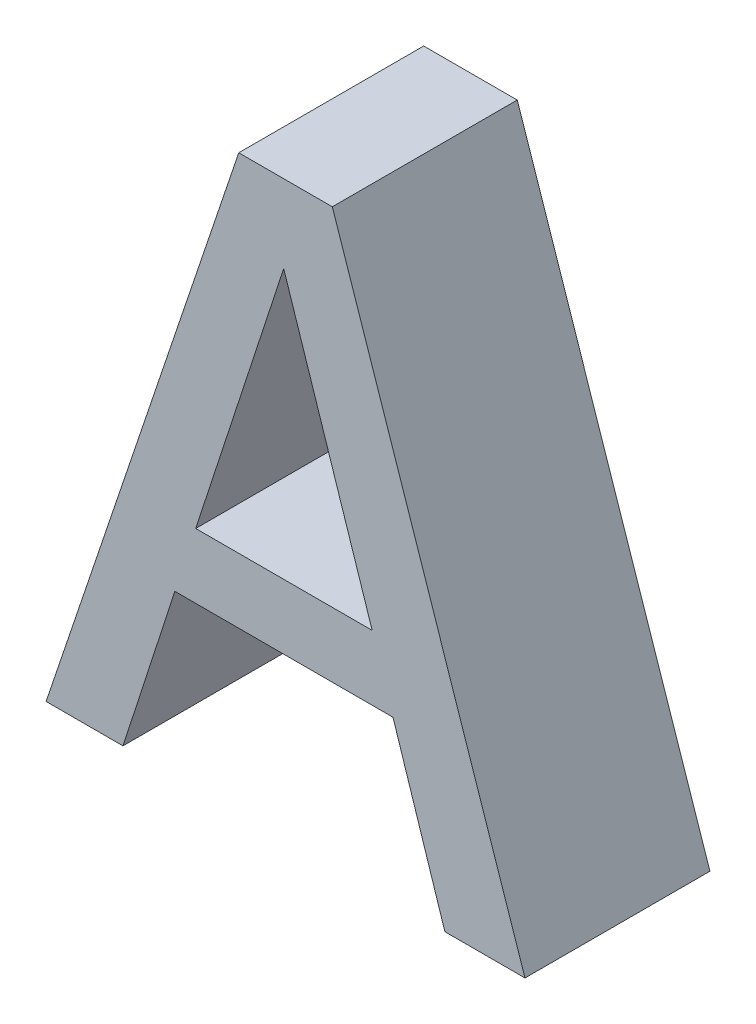
ISO-10303-21;
HEADER;
FILE_DESCRIPTION(('STEP AP214'),'2;1');
FILE_NAME('part.step','',(''),(''),'','','');
FILE_SCHEMA(('AUTOMOTIVE_DESIGN { 1 0 10303 214 1 1 1 1 }'));
ENDSEC;
DATA;
#1=APPLICATION_CONTEXT('core data for automotive mechanical design processes');
#2=APPLICATION_PROTOCOL_DEFINITION('international standard','automotive_design',2000,#1);
#3=PRODUCT_CONTEXT('',#1,'mechanical');
#4=PRODUCT('Part','Part','',(#3));
#5=PRODUCT_RELATED_PRODUCT_CATEGORY('part','',(#4));
#6=PRODUCT_DEFINITION_FORMATION('','',#4);
#7=PRODUCT_DEFINITION_CONTEXT('part definition',#1,'design');
#8=PRODUCT_DEFINITION('design','',#6,#7);
#9=PRODUCT_DEFINITION_SHAPE('','',#8);
#10=(LENGTH_UNIT() NAMED_UNIT(*) SI_UNIT(.MILLI.,.METRE.));
#11=(NAMED_UNIT(*) PLANE_ANGLE_UNIT() SI_UNIT($,.RADIAN.));
#12=(NAMED_UNIT(*) SI_UNIT($,.STERADIAN.) SOLID_ANGLE_UNIT());
#13=UNCERTAINTY_MEASURE_WITH_UNIT(LENGTH_MEASURE(1.E-05),#10,'distance_accuracy_value','');
#14=(GEOMETRIC_REPRESENTATION_CONTEXT(3) GLOBAL_UNCERTAINTY_ASSIGNED_CONTEXT((#13)) GLOBAL_UNIT_ASSIGNED_CONTEXT((#10,
#11,#12)) REPRESENTATION_CONTEXT('',''));
#15=CARTESIAN_POINT('',(0.,0.,0.));
#16=DIRECTION('',(0.,0.,1.));
#17=DIRECTION('',(1.,0.,0.));
#18=AXIS2_PLACEMENT_3D('',#15,#16,#17);
#19=CARTESIAN_POINT('',(-0.272917524688725,-2.820219551191,0.));
#20=DIRECTION('',(0.,-1.,0.));
#21=DIRECTION('',(1.,0.,0.));
#22=AXIS2_PLACEMENT_3D('',#19,#20,#21);
#23=PLANE('',#22);
#24=DIRECTION('',(1.,0.,0.));
#25=VECTOR('',#24,1.);
#26=CARTESIAN_POINT('',(-0.248670731843592,-2.820219551191,0.));
#27=LINE('',#26,#25);
#28=CARTESIAN_POINT('',(-0.272917524688725,-2.820219551191,0.));
#29=VERTEX_POINT('',#28);
#30=CARTESIAN_POINT('',(-0.177481272173995,-2.820219551191,0.));
#31=VERTEX_POINT('',#30);
#32=EDGE_CURVE('E11',#29,#31,#27,.T.);
#33=ORIENTED_EDGE('',*,*,#32,.F.);
#34=DIRECTION('',(0.,0.,1.));
#35=VECTOR('',#34,1.);
#36=CARTESIAN_POINT('',(-0.272917524688725,-2.820219551191,0.));
#37=LINE('',#36,#35);
#38=CARTESIAN_POINT('',(-0.272917524688725,-2.820219551191,0.1));
#39=VERTEX_POINT('',#38);
#40=EDGE_CURVE('E24',#29,#39,#37,.T.);
#41=ORIENTED_EDGE('',*,*,#40,.T.);
#42=DIRECTION('',(-1.,0.,0.));
#43=VECTOR('',#42,1.);
#44=CARTESIAN_POINT('',(-0.248670731843592,-2.820219551191,0.1));
#45=LINE('',#44,#43);
#46=CARTESIAN_POINT('',(-0.177481272173995,-2.820219551191,0.1));
#47=VERTEX_POINT('',#46);
#48=EDGE_CURVE('E186',#47,#39,#45,.T.);
#49=ORIENTED_EDGE('',*,*,#48,.F.);
#50=DIRECTION('',(0.,0.,1.));
#51=VECTOR('',#50,1.);
#52=CARTESIAN_POINT('',(-0.177481272173995,-2.820219551191,0.));
#53=LINE('',#52,#51);
#54=EDGE_CURVE('E183',#31,#47,#53,.T.);
#55=ORIENTED_EDGE('',*,*,#54,.F.);
#56=EDGE_LOOP('',(#33,#41,#49,#55));
#57=FACE_BOUND('',#56,.T.);
#58=ADVANCED_FACE('F17',(#57),#23,.F.);
#59=CARTESIAN_POINT('',(-0.225324642857232,-2.674685528327,0.));
#60=DIRECTION('',(-0.95046744572869,0.310824121666869,0.));
#61=DIRECTION('',(-0.310824121666869,-0.95046744572869,0.));
#62=AXIS2_PLACEMENT_3D('',#59,#60,#61);
#63=PLANE('',#62);
#64=DIRECTION('',(-0.310824121666869,-0.95046744572869,0.));
#65=VECTOR('',#64,1.);
#66=CARTESIAN_POINT('',(-0.246454480241802,-2.739298346856,0.));
#67=LINE('',#66,#65);
#68=CARTESIAN_POINT('',(-0.225324642857232,-2.674685528327,0.));
#69=VERTEX_POINT('',#68);
#70=EDGE_CURVE('E181',#69,#29,#67,.T.);
#71=ORIENTED_EDGE('',*,*,#70,.F.);
#72=DIRECTION('',(0.,0.,1.));
#73=VECTOR('',#72,1.);
#74=CARTESIAN_POINT('',(-0.225324642857232,-2.674685528327,0.));
#75=LINE('',#74,#73);
#76=CARTESIAN_POINT('',(-0.225324642857232,-2.674685528327,0.1));
#77=VERTEX_POINT('',#76);
#78=EDGE_CURVE('E179',#69,#77,#75,.T.);
#79=ORIENTED_EDGE('',*,*,#78,.T.);
#80=DIRECTION('',(0.310824121666869,0.95046744572869,0.));
#81=VECTOR('',#80,1.);
#82=CARTESIAN_POINT('',(-0.246454480241802,-2.739298346856,0.1));
#83=LINE('',#82,#81);
#84=EDGE_CURVE('E176',#39,#77,#83,.T.);
#85=ORIENTED_EDGE('',*,*,#84,.F.);
#86=ORIENTED_EDGE('',*,*,#40,.F.);
#87=EDGE_LOOP('',(#71,#79,#85,#86));
#88=FACE_BOUND('',#87,.T.);
#89=ADVANCED_FACE('F191',(#88),#63,.F.);
#90=CARTESIAN_POINT('',(-0.177481272173995,-2.820219551191,0.));
#91=DIRECTION('',(0.949983248285707,0.312300861312512,0.));
#92=DIRECTION('',(-0.312300861312512,0.949983248285707,0.));
#93=AXIS2_PLACEMENT_3D('',#90,#91,#92);
#94=PLANE('',#93);
#95=DIRECTION('',(-0.312300861312512,0.949983248285707,0.));
#96=VECTOR('',#95,1.);
#97=CARTESIAN_POINT('',(-0.180095929310553,-2.812266065346,0.));
#98=LINE('',#97,#96);
#99=EDGE_CURVE('E174',#31,#69,#98,.T.);
#100=ORIENTED_EDGE('',*,*,#99,.F.);
#101=ORIENTED_EDGE('',*,*,#54,.T.);
#102=DIRECTION('',(0.312300861312512,-0.949983248285707,0.));
#103=VECTOR('',#102,1.);
#104=CARTESIAN_POINT('',(-0.180095929310553,-2.812266065346,0.1));
#105=LINE('',#104,#103);
#106=EDGE_CURVE('E171',#77,#47,#105,.T.);
#107=ORIENTED_EDGE('',*,*,#106,.F.);
#108=ORIENTED_EDGE('',*,*,#78,.F.);
#109=EDGE_LOOP('',(#100,#101,#107,#108));
#110=FACE_BOUND('',#109,.T.);
#111=ADVANCED_FACE('F195',(#110),#94,.F.);
#112=CARTESIAN_POINT('',(-0.199023313424039,-2.632603401234,0.));
#113=DIRECTION('',(0.,1.,0.));
#114=DIRECTION('',(-1.,0.,0.));
#115=AXIS2_PLACEMENT_3D('',#112,#113,#114);
#116=PLANE('',#115);
#117=DIRECTION('',(1.,0.,0.));
#118=VECTOR('',#117,1.);
#119=CARTESIAN_POINT('',(-0.249622061476468,-2.632603401234,0.));
#120=LINE('',#119,#118);
#121=CARTESIAN_POINT('',(-0.249622061476468,-2.632603401234,0.));
#122=VERTEX_POINT('',#121);
#123=CARTESIAN_POINT('',(-0.199023313424039,-2.632603401234,0.));
#124=VERTEX_POINT('',#123);
#125=EDGE_CURVE('E169',#122,#124,#120,.T.);
#126=ORIENTED_EDGE('',*,*,#125,.F.);
#127=DIRECTION('',(0.,0.,1.));
#128=VECTOR('',#127,1.);
#129=CARTESIAN_POINT('',(-0.249622061476468,-2.632603401234,0.));
#130=LINE('',#129,#128);
#131=CARTESIAN_POINT('',(-0.249622061476468,-2.632603401234,0.1));
#132=VERTEX_POINT('',#131);
#133=EDGE_CURVE('E167',#122,#132,#130,.T.);
#134=ORIENTED_EDGE('',*,*,#133,.T.);
#135=DIRECTION('',(-1.,0.,0.));
#136=VECTOR('',#135,1.);
#137=CARTESIAN_POINT('',(-0.249622061476468,-2.632603401234,0.1));
#138=LINE('',#137,#136);
#139=CARTESIAN_POINT('',(-0.199023313424039,-2.632603401234,0.1));
#140=VERTEX_POINT('',#139);
#141=EDGE_CURVE('E122',#140,#132,#138,.T.);
#142=ORIENTED_EDGE('',*,*,#141,.F.);
#143=DIRECTION('',(0.,0.,1.));
#144=VECTOR('',#143,1.);
#145=CARTESIAN_POINT('',(-0.199023313424039,-2.632603401234,0.));
#146=LINE('',#145,#144);
#147=EDGE_CURVE('E163',#124,#140,#146,.T.);
#148=ORIENTED_EDGE('',*,*,#147,.F.);
#149=EDGE_LOOP('',(#126,#134,#142,#148));
#150=FACE_BOUND('',#149,.T.);
#151=ADVANCED_FACE('F214',(#150),#116,.T.);
#152=CARTESIAN_POINT('',(-0.0948199510982438,-2.941706644287,0.));
#153=DIRECTION('',(0.947602739606771,0.319451166674568,0.));
#154=DIRECTION('',(-0.319451166674568,0.947602739606771,0.));
#155=AXIS2_PLACEMENT_3D('',#152,#153,#154);
#156=PLANE('',#155);
#157=DIRECTION('',(0.319451166674568,-0.947602739606771,0.));
#158=VECTOR('',#157,1.);
#159=CARTESIAN_POINT('',(-0.199023313424039,-2.632603401234,0.));
#160=LINE('',#159,#158);
#161=CARTESIAN_POINT('',(-0.0948199510982438,-2.941706644287,0.));
#162=VERTEX_POINT('',#161);
#163=EDGE_CURVE('E161',#124,#162,#160,.T.);
#164=ORIENTED_EDGE('',*,*,#163,.F.);
#165=ORIENTED_EDGE('',*,*,#147,.T.);
#166=DIRECTION('',(-0.319451166674568,0.947602739606771,0.));
#167=VECTOR('',#166,1.);
#168=CARTESIAN_POINT('',(-0.199023313424039,-2.632603401234,0.1));
#169=LINE('',#168,#167);
#170=CARTESIAN_POINT('',(-0.0948199510982438,-2.941706644287,0.1));
#171=VERTEX_POINT('',#170);
#172=EDGE_CURVE('E159',#171,#140,#169,.T.);
#173=ORIENTED_EDGE('',*,*,#172,.F.);
#174=DIRECTION('',(0.,0.,1.));
#175=VECTOR('',#174,1.);
#176=CARTESIAN_POINT('',(-0.0948199510982438,-2.941706644287,0.));
#177=LINE('',#176,#175);
#178=EDGE_CURVE('E156',#162,#171,#177,.T.);
#179=ORIENTED_EDGE('',*,*,#178,.F.);
#180=EDGE_LOOP('',(#164,#165,#173,#179));
#181=FACE_BOUND('',#180,.T.);
#182=ADVANCED_FACE('F219',(#181),#156,.T.);
#183=CARTESIAN_POINT('',(-0.138154522450077,-2.941706644287,0.));
#184=DIRECTION('',(0.,-1.,0.));
#185=DIRECTION('',(1.,0.,0.));
#186=AXIS2_PLACEMENT_3D('',#183,#184,#185);
#187=PLANE('',#186);
#188=DIRECTION('',(-1.,0.,0.));
#189=VECTOR('',#188,1.);
#190=CARTESIAN_POINT('',(-0.0948199510982438,-2.941706644287,0.));
#191=LINE('',#190,#189);
#192=CARTESIAN_POINT('',(-0.138154522450077,-2.941706644287,0.));
#193=VERTEX_POINT('',#192);
#194=EDGE_CURVE('E154',#162,#193,#191,.T.);
#195=ORIENTED_EDGE('',*,*,#194,.F.);
#196=ORIENTED_EDGE('',*,*,#178,.T.);
#197=DIRECTION('',(1.,0.,0.));
#198=VECTOR('',#197,1.);
#199=CARTESIAN_POINT('',(-0.0948199510982438,-2.941706644287,0.1));
#200=LINE('',#199,#198);
#201=CARTESIAN_POINT('',(-0.138154522450077,-2.941706644287,0.1));
#202=VERTEX_POINT('',#201);
#203=EDGE_CURVE('E151',#202,#171,#200,.T.);
#204=ORIENTED_EDGE('',*,*,#203,.F.);
#205=DIRECTION('',(0.,0.,1.));
#206=VECTOR('',#205,1.);
#207=CARTESIAN_POINT('',(-0.138154522450077,-2.941706644287,0.));
#208=LINE('',#207,#206);
#209=EDGE_CURVE('E148',#193,#202,#208,.T.);
#210=ORIENTED_EDGE('',*,*,#209,.F.);
#211=EDGE_LOOP('',(#195,#196,#204,#210));
#212=FACE_BOUND('',#211,.T.);
#213=ADVANCED_FACE('F223',(#212),#187,.T.);
#214=CARTESIAN_POINT('',(-0.166209273845483,-2.855287990435,0.));
#215=DIRECTION('',(-0.951135317488762,-0.308774363938381,0.));
#216=DIRECTION('',(0.308774363938381,-0.951135317488762,0.));
#217=AXIS2_PLACEMENT_3D('',#214,#215,#216);
#218=PLANE('',#217);
#219=DIRECTION('',(-0.308774363938381,0.951135317488762,0.));
#220=VECTOR('',#219,1.);
#221=CARTESIAN_POINT('',(-0.138154522450077,-2.941706644287,0.));
#222=LINE('',#221,#220);
#223=CARTESIAN_POINT('',(-0.166209273845483,-2.855287990435,0.));
#224=VERTEX_POINT('',#223);
#225=EDGE_CURVE('E146',#193,#224,#222,.T.);
#226=ORIENTED_EDGE('',*,*,#225,.F.);
#227=ORIENTED_EDGE('',*,*,#209,.T.);
#228=DIRECTION('',(0.308774363938381,-0.951135317488762,0.));
#229=VECTOR('',#228,1.);
#230=CARTESIAN_POINT('',(-0.138154522450077,-2.941706644287,0.1));
#231=LINE('',#230,#229);
#232=CARTESIAN_POINT('',(-0.166209273845483,-2.855287990435,0.1));
#233=VERTEX_POINT('',#232);
#234=EDGE_CURVE('E143',#233,#202,#231,.T.);
#235=ORIENTED_EDGE('',*,*,#234,.F.);
#236=DIRECTION('',(0.,0.,1.));
#237=VECTOR('',#236,1.);
#238=CARTESIAN_POINT('',(-0.166209273845483,-2.855287990435,0.));
#239=LINE('',#238,#237);
#240=EDGE_CURVE('E140',#224,#233,#239,.T.);
#241=ORIENTED_EDGE('',*,*,#240,.F.);
#242=EDGE_LOOP('',(#226,#227,#235,#241));
#243=FACE_BOUND('',#242,.T.);
#244=ADVANCED_FACE('F227',(#243),#218,.T.);
#245=CARTESIAN_POINT('',(-0.284189523017237,-2.855287990435,0.));
#246=DIRECTION('',(0.,-1.,0.));
#247=DIRECTION('',(1.,0.,0.));
#248=AXIS2_PLACEMENT_3D('',#245,#246,#247);
#249=PLANE('',#248);
#250=DIRECTION('',(-1.,0.,0.));
#251=VECTOR('',#250,1.);
#252=CARTESIAN_POINT('',(-0.166209273845483,-2.855287990435,0.));
#253=LINE('',#252,#251);
#254=CARTESIAN_POINT('',(-0.284189523017237,-2.855287990435,0.));
#255=VERTEX_POINT('',#254);
#256=EDGE_CURVE('E138',#224,#255,#253,.T.);
#257=ORIENTED_EDGE('',*,*,#256,.F.);
#258=ORIENTED_EDGE('',*,*,#240,.T.);
#259=DIRECTION('',(1.,0.,0.));
#260=VECTOR('',#259,1.);
#261=CARTESIAN_POINT('',(-0.166209273845483,-2.855287990435,0.1));
#262=LINE('',#261,#260);
#263=CARTESIAN_POINT('',(-0.284189523017237,-2.855287990435,0.1));
#264=VERTEX_POINT('',#263);
#265=EDGE_CURVE('E135',#264,#233,#262,.T.);
#266=ORIENTED_EDGE('',*,*,#265,.F.);
#267=DIRECTION('',(0.,0.,1.));
#268=VECTOR('',#267,1.);
#269=CARTESIAN_POINT('',(-0.284189523017237,-2.855287990435,0.));
#270=LINE('',#269,#268);
#271=EDGE_CURVE('E132',#255,#264,#270,.T.);
#272=ORIENTED_EDGE('',*,*,#271,.F.);
#273=EDGE_LOOP('',(#257,#258,#266,#272));
#274=FACE_BOUND('',#273,.T.);
#275=ADVANCED_FACE('F231',(#274),#249,.T.);
#276=CARTESIAN_POINT('',(-0.312244274412643,-2.941706644287,0.));
#277=DIRECTION('',(0.951135317488762,-0.308774363938381,0.));
#278=DIRECTION('',(0.308774363938381,0.951135317488762,0.));
#279=AXIS2_PLACEMENT_3D('',#276,#277,#278);
#280=PLANE('',#279);
#281=DIRECTION('',(-0.308774363938381,-0.951135317488762,0.));
#282=VECTOR('',#281,1.);
#283=CARTESIAN_POINT('',(-0.284189523017237,-2.855287990435,0.));
#284=LINE('',#283,#282);
#285=CARTESIAN_POINT('',(-0.312244274412643,-2.941706644287,0.));
#286=VERTEX_POINT('',#285);
#287=EDGE_CURVE('E130',#255,#286,#284,.T.);
#288=ORIENTED_EDGE('',*,*,#287,.F.);
#289=ORIENTED_EDGE('',*,*,#271,.T.);
#290=DIRECTION('',(0.308774363938381,0.951135317488762,0.));
#291=VECTOR('',#290,1.);
#292=CARTESIAN_POINT('',(-0.284189523017237,-2.855287990435,0.1));
#293=LINE('',#292,#291);
#294=CARTESIAN_POINT('',(-0.312244274412643,-2.941706644287,0.1));
#295=VERTEX_POINT('',#294);
#296=EDGE_CURVE('E128',#295,#264,#293,.T.);
#297=ORIENTED_EDGE('',*,*,#296,.F.);
#298=DIRECTION('',(0.,0.,1.));
#299=VECTOR('',#298,1.);
#300=CARTESIAN_POINT('',(-0.312244274412643,-2.941706644287,0.));
#301=LINE('',#300,#299);
#302=EDGE_CURVE('E104',#286,#295,#301,.T.);
#303=ORIENTED_EDGE('',*,*,#302,.F.);
#304=EDGE_LOOP('',(#288,#289,#297,#303));
#305=FACE_BOUND('',#304,.T.);
#306=ADVANCED_FACE('F235',(#305),#280,.T.);
#307=CARTESIAN_POINT('',(-0.353825423802263,-2.941706644287,0.));
#308=DIRECTION('',(0.,-1.,0.));
#309=DIRECTION('',(1.,0.,0.));
#310=AXIS2_PLACEMENT_3D('',#307,#308,#309);
#311=PLANE('',#310);
#312=DIRECTION('',(-1.,0.,0.));
#313=VECTOR('',#312,1.);
#314=CARTESIAN_POINT('',(-0.312244274412643,-2.941706644287,0.));
#315=LINE('',#314,#313);
#316=CARTESIAN_POINT('',(-0.353825423802263,-2.941706644287,0.));
#317=VERTEX_POINT('',#316);
#318=EDGE_CURVE('E108',#286,#317,#315,.T.);
#319=ORIENTED_EDGE('',*,*,#318,.F.);
#320=ORIENTED_EDGE('',*,*,#302,.T.);
#321=DIRECTION('',(1.,0.,0.));
#322=VECTOR('',#321,1.);
#323=CARTESIAN_POINT('',(-0.312244274412643,-2.941706644287,0.1));
#324=LINE('',#323,#322);
#325=CARTESIAN_POINT('',(-0.353825423802263,-2.941706644287,0.1));
#326=VERTEX_POINT('',#325);
#327=EDGE_CURVE('E97',#326,#295,#324,.T.);
#328=ORIENTED_EDGE('',*,*,#327,.F.);
#329=DIRECTION('',(0.,0.,1.));
#330=VECTOR('',#329,1.);
#331=CARTESIAN_POINT('',(-0.353825423802263,-2.941706644287,0.));
#332=LINE('',#331,#330);
#333=EDGE_CURVE('E101',#317,#326,#332,.T.);
#334=ORIENTED_EDGE('',*,*,#333,.F.);
#335=EDGE_LOOP('',(#319,#320,#328,#334));
#336=FACE_BOUND('',#335,.T.);
#337=ADVANCED_FACE('F100',(#336),#311,.T.);
#338=CARTESIAN_POINT('',(-0.249622061476468,-2.632603401234,0.));
#339=DIRECTION('',(-0.947602739606771,0.319451166674568,0.));
#340=DIRECTION('',(-0.319451166674568,-0.947602739606771,0.));
#341=AXIS2_PLACEMENT_3D('',#338,#339,#340);
#342=PLANE('',#341);
#343=DIRECTION('',(0.319451166674568,0.947602739606771,0.));
#344=VECTOR('',#343,1.);
#345=CARTESIAN_POINT('',(-0.353825423802263,-2.941706644287,0.));
#346=LINE('',#345,#344);
#347=EDGE_CURVE('E116',#317,#122,#346,.T.);
#348=ORIENTED_EDGE('',*,*,#347,.F.);
#349=ORIENTED_EDGE('',*,*,#333,.T.);
#350=DIRECTION('',(-0.319451166674568,-0.947602739606771,0.));
#351=VECTOR('',#350,1.);
#352=CARTESIAN_POINT('',(-0.353825423802263,-2.941706644287,0.1));
#353=LINE('',#352,#351);
#354=EDGE_CURVE('E114',#132,#326,#353,.T.);
#355=ORIENTED_EDGE('',*,*,#354,.F.);
#356=ORIENTED_EDGE('',*,*,#133,.F.);
#357=EDGE_LOOP('',(#348,#349,#355,#356));
#358=FACE_BOUND('',#357,.T.);
#359=ADVANCED_FACE('F112',(#358),#342,.T.);
#360=CARTESIAN_POINT('',(-0.224423938998458,-2.818025574919,0.));
#361=DIRECTION('',(0.,0.,1.));
#362=DIRECTION('',(1.,0.,0.));
#363=AXIS2_PLACEMENT_3D('',#360,#361,#362);
#364=PLANE('',#363);
#365=ORIENTED_EDGE('',*,*,#347,.T.);
#366=ORIENTED_EDGE('',*,*,#125,.T.);
#367=ORIENTED_EDGE('',*,*,#163,.T.);
#368=ORIENTED_EDGE('',*,*,#194,.T.);
#369=ORIENTED_EDGE('',*,*,#225,.T.);
#370=ORIENTED_EDGE('',*,*,#256,.T.);
#371=ORIENTED_EDGE('',*,*,#287,.T.);
#372=ORIENTED_EDGE('',*,*,#318,.T.);
#373=EDGE_LOOP('',(#365,#366,#367,#368,#369,#370,#371,#372));
#374=FACE_BOUND('',#373,.T.);
#375=ORIENTED_EDGE('',*,*,#32,.T.);
#376=ORIENTED_EDGE('',*,*,#99,.T.);
#377=ORIENTED_EDGE('',*,*,#70,.T.);
#378=EDGE_LOOP('',(#375,#376,#377));
#379=FACE_BOUND('',#378,.T.);
#380=ADVANCED_FACE('F196',(#374,#379),#364,.F.);
#381=CARTESIAN_POINT('',(-0.224423938998458,-2.818025574919,0.1));
#382=DIRECTION('',(0.,0.,1.));
#383=DIRECTION('',(1.,0.,0.));
#384=AXIS2_PLACEMENT_3D('',#381,#382,#383);
#385=PLANE('',#384);
#386=ORIENTED_EDGE('',*,*,#354,.T.);
#387=ORIENTED_EDGE('',*,*,#327,.T.);
#388=ORIENTED_EDGE('',*,*,#296,.T.);
#389=ORIENTED_EDGE('',*,*,#265,.T.);
#390=ORIENTED_EDGE('',*,*,#234,.T.);
#391=ORIENTED_EDGE('',*,*,#203,.T.);
#392=ORIENTED_EDGE('',*,*,#172,.T.);
#393=ORIENTED_EDGE('',*,*,#141,.T.);
#394=EDGE_LOOP('',(#386,#387,#388,#389,#390,#391,#392,#393));
#395=FACE_BOUND('',#394,.T.);
#396=ORIENTED_EDGE('',*,*,#48,.T.);
#397=ORIENTED_EDGE('',*,*,#84,.T.);
#398=ORIENTED_EDGE('',*,*,#106,.T.);
#399=EDGE_LOOP('',(#396,#397,#398));
#400=FACE_BOUND('',#399,.T.);
#401=ADVANCED_FACE('F119',(#395,#400),#385,.T.);
#402=CLOSED_SHELL('',(#58,#89,#111,#151,#182,#213,#244,#275,#306,#337,#359,#380,#401));
#403=MANIFOLD_SOLID_BREP('B1',#402);
#404=ADVANCED_BREP_SHAPE_REPRESENTATION('',(#18,#403),#14);
#405=SHAPE_DEFINITION_REPRESENTATION(#9,#404);
ENDSEC;
END-ISO-10303-21;
